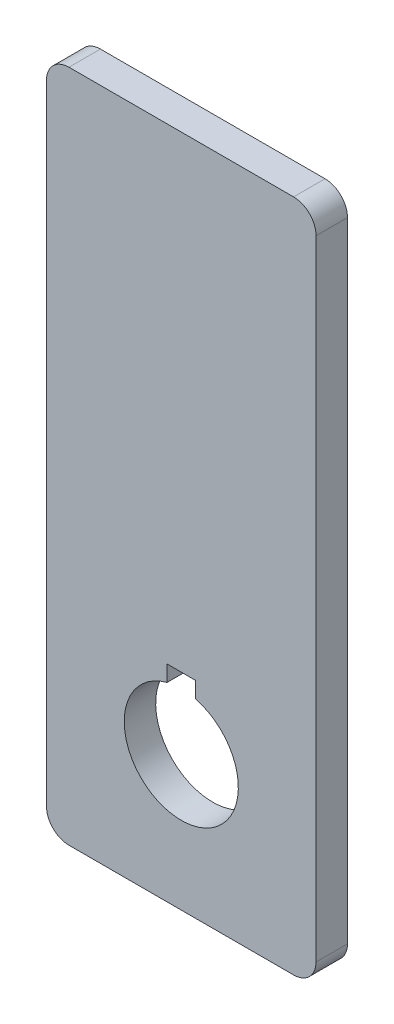
ISO-10303-21;
HEADER;
FILE_DESCRIPTION(('STEP AP214'),'2;1');
FILE_NAME('part.step','',(''),(''),'','','');
FILE_SCHEMA(('AUTOMOTIVE_DESIGN { 1 0 10303 214 1 1 1 1 }'));
ENDSEC;
DATA;
#1=APPLICATION_CONTEXT('core data for automotive mechanical design processes');
#2=APPLICATION_PROTOCOL_DEFINITION('international standard','automotive_design',2000,#1);
#3=PRODUCT_CONTEXT('',#1,'mechanical');
#4=PRODUCT('Part','Part','',(#3));
#5=PRODUCT_RELATED_PRODUCT_CATEGORY('part','',(#4));
#6=PRODUCT_DEFINITION_FORMATION('','',#4);
#7=PRODUCT_DEFINITION_CONTEXT('part definition',#1,'design');
#8=PRODUCT_DEFINITION('design','',#6,#7);
#9=PRODUCT_DEFINITION_SHAPE('','',#8);
#10=(LENGTH_UNIT() NAMED_UNIT(*) SI_UNIT(.MILLI.,.METRE.));
#11=(NAMED_UNIT(*) PLANE_ANGLE_UNIT() SI_UNIT($,.RADIAN.));
#12=(NAMED_UNIT(*) SI_UNIT($,.STERADIAN.) SOLID_ANGLE_UNIT());
#13=UNCERTAINTY_MEASURE_WITH_UNIT(LENGTH_MEASURE(1.E-05),#10,'distance_accuracy_value','');
#14=(GEOMETRIC_REPRESENTATION_CONTEXT(3) GLOBAL_UNCERTAINTY_ASSIGNED_CONTEXT((#13)) GLOBAL_UNIT_ASSIGNED_CONTEXT((#10,
#11,#12)) REPRESENTATION_CONTEXT('',''));
#15=CARTESIAN_POINT('',(0.,0.,0.));
#16=DIRECTION('',(0.,0.,1.));
#17=DIRECTION('',(1.,0.,0.));
#18=AXIS2_PLACEMENT_3D('',#15,#16,#17);
#19=CARTESIAN_POINT('',(25.,-25.,7.));
#20=DIRECTION('',(0.,0.,1.));
#21=DIRECTION('',(1.,0.,0.));
#22=AXIS2_PLACEMENT_3D('',#19,#20,#21);
#23=PLANE('',#22);
#24=DIRECTION('',(0.,-1.,0.));
#25=VECTOR('',#24,1.);
#26=CARTESIAN_POINT('',(-3.175,15.875,7.));
#27=LINE('',#26,#25);
#28=CARTESIAN_POINT('',(-3.175,15.875,7.));
#29=VERTEX_POINT('',#28);
#30=CARTESIAN_POINT('',(-3.175,12.2967221242086,7.));
#31=VERTEX_POINT('',#30);
#32=EDGE_CURVE('E186',#29,#31,#27,.T.);
#33=ORIENTED_EDGE('',*,*,#32,.F.);
#34=DIRECTION('',(-1.,0.,0.));
#35=VECTOR('',#34,1.);
#36=CARTESIAN_POINT('',(3.175,15.875,7.));
#37=LINE('',#36,#35);
#38=CARTESIAN_POINT('',(3.175,15.875,7.));
#39=VERTEX_POINT('',#38);
#40=EDGE_CURVE('E310',#39,#29,#37,.T.);
#41=ORIENTED_EDGE('',*,*,#40,.F.);
#42=DIRECTION('',(0.,1.,0.));
#43=VECTOR('',#42,1.);
#44=CARTESIAN_POINT('',(3.175,15.875,7.));
#45=LINE('',#44,#43);
#46=CARTESIAN_POINT('',(3.175,12.2967221242085,7.));
#47=VERTEX_POINT('',#46);
#48=EDGE_CURVE('E305',#47,#39,#45,.T.);
#49=ORIENTED_EDGE('',*,*,#48,.F.);
#50=CARTESIAN_POINT('',(0.,0.,7.));
#51=DIRECTION('',(0.,0.,1.));
#52=DIRECTION('',(1.,0.,0.));
#53=AXIS2_PLACEMENT_3D('',#50,#51,#52);
#54=CIRCLE('',#53,12.7);
#55=EDGE_CURVE('E145',#31,#47,#54,.T.);
#56=ORIENTED_EDGE('',*,*,#55,.F.);
#57=EDGE_LOOP('',(#33,#41,#49,#56));
#58=FACE_BOUND('',#57,.T.);
#59=CARTESIAN_POINT('',(25.,-25.,7.));
#60=DIRECTION('',(0.,0.,1.));
#61=DIRECTION('',(1.,0.,0.));
#62=AXIS2_PLACEMENT_3D('',#59,#60,#61);
#63=CIRCLE('',#62,5.);
#64=CARTESIAN_POINT('',(25.,-30.,7.));
#65=VERTEX_POINT('',#64);
#66=CARTESIAN_POINT('',(30.,-25.,7.));
#67=VERTEX_POINT('',#66);
#68=EDGE_CURVE('E157',#65,#67,#63,.T.);
#69=ORIENTED_EDGE('',*,*,#68,.T.);
#70=DIRECTION('',(0.,1.,0.));
#71=VECTOR('',#70,1.);
#72=CARTESIAN_POINT('',(30.,-25.,7.));
#73=LINE('',#72,#71);
#74=CARTESIAN_POINT('',(30.,115.,7.));
#75=VERTEX_POINT('',#74);
#76=EDGE_CURVE('E99',#67,#75,#73,.T.);
#77=ORIENTED_EDGE('',*,*,#76,.T.);
#78=CARTESIAN_POINT('',(25.,115.,7.));
#79=DIRECTION('',(0.,0.,1.));
#80=DIRECTION('',(-1.,0.,0.));
#81=AXIS2_PLACEMENT_3D('',#78,#79,#80);
#82=CIRCLE('',#81,5.);
#83=CARTESIAN_POINT('',(25.,120.,7.));
#84=VERTEX_POINT('',#83);
#85=EDGE_CURVE('E203',#75,#84,#82,.T.);
#86=ORIENTED_EDGE('',*,*,#85,.T.);
#87=DIRECTION('',(-1.,0.,0.));
#88=VECTOR('',#87,1.);
#89=CARTESIAN_POINT('',(-25.,120.,7.));
#90=LINE('',#89,#88);
#91=CARTESIAN_POINT('',(-25.,120.,7.));
#92=VERTEX_POINT('',#91);
#93=EDGE_CURVE('E205',#84,#92,#90,.T.);
#94=ORIENTED_EDGE('',*,*,#93,.T.);
#95=CARTESIAN_POINT('',(-25.,115.,7.));
#96=DIRECTION('',(0.,0.,1.));
#97=DIRECTION('',(-1.,0.,0.));
#98=AXIS2_PLACEMENT_3D('',#95,#96,#97);
#99=CIRCLE('',#98,5.);
#100=CARTESIAN_POINT('',(-30.,115.,7.));
#101=VERTEX_POINT('',#100);
#102=EDGE_CURVE('E120',#92,#101,#99,.T.);
#103=ORIENTED_EDGE('',*,*,#102,.T.);
#104=DIRECTION('',(0.,-1.,0.));
#105=VECTOR('',#104,1.);
#106=CARTESIAN_POINT('',(-30.,-25.,7.));
#107=LINE('',#106,#105);
#108=CARTESIAN_POINT('',(-30.,-25.,7.));
#109=VERTEX_POINT('',#108);
#110=EDGE_CURVE('E114',#101,#109,#107,.T.);
#111=ORIENTED_EDGE('',*,*,#110,.T.);
#112=CARTESIAN_POINT('',(-25.,-25.,7.));
#113=DIRECTION('',(0.,0.,1.));
#114=DIRECTION('',(-1.,0.,0.));
#115=AXIS2_PLACEMENT_3D('',#112,#113,#114);
#116=CIRCLE('',#115,5.);
#117=CARTESIAN_POINT('',(-25.,-30.,7.));
#118=VERTEX_POINT('',#117);
#119=EDGE_CURVE('E117',#109,#118,#116,.T.);
#120=ORIENTED_EDGE('',*,*,#119,.T.);
#121=DIRECTION('',(1.,0.,0.));
#122=VECTOR('',#121,1.);
#123=CARTESIAN_POINT('',(-25.,-30.,7.));
#124=LINE('',#123,#122);
#125=EDGE_CURVE('E57',#118,#65,#124,.T.);
#126=ORIENTED_EDGE('',*,*,#125,.T.);
#127=EDGE_LOOP('',(#69,#77,#86,#94,#103,#111,#120,#126));
#128=FACE_BOUND('',#127,.T.);
#129=ADVANCED_FACE('F33',(#58,#128),#23,.T.);
#130=CARTESIAN_POINT('',(25.,-25.,0.));
#131=DIRECTION('',(0.,0.,1.));
#132=DIRECTION('',(1.,0.,0.));
#133=AXIS2_PLACEMENT_3D('',#130,#131,#132);
#134=PLANE('',#133);
#135=CARTESIAN_POINT('',(25.,-25.,0.));
#136=DIRECTION('',(0.,0.,1.));
#137=DIRECTION('',(1.,0.,0.));
#138=AXIS2_PLACEMENT_3D('',#135,#136,#137);
#139=CIRCLE('',#138,5.);
#140=CARTESIAN_POINT('',(25.,-30.,0.));
#141=VERTEX_POINT('',#140);
#142=CARTESIAN_POINT('',(30.,-25.,0.));
#143=VERTEX_POINT('',#142);
#144=EDGE_CURVE('E141',#141,#143,#139,.T.);
#145=ORIENTED_EDGE('',*,*,#144,.F.);
#146=DIRECTION('',(1.,0.,0.));
#147=VECTOR('',#146,1.);
#148=CARTESIAN_POINT('',(-25.,-30.,0.));
#149=LINE('',#148,#147);
#150=CARTESIAN_POINT('',(-25.,-30.,0.));
#151=VERTEX_POINT('',#150);
#152=EDGE_CURVE('E90',#151,#141,#149,.T.);
#153=ORIENTED_EDGE('',*,*,#152,.F.);
#154=CARTESIAN_POINT('',(-25.,-25.,0.));
#155=DIRECTION('',(0.,0.,1.));
#156=DIRECTION('',(-1.,0.,0.));
#157=AXIS2_PLACEMENT_3D('',#154,#155,#156);
#158=CIRCLE('',#157,5.);
#159=CARTESIAN_POINT('',(-30.,-25.,0.));
#160=VERTEX_POINT('',#159);
#161=EDGE_CURVE('E154',#160,#151,#158,.T.);
#162=ORIENTED_EDGE('',*,*,#161,.F.);
#163=DIRECTION('',(0.,-1.,0.));
#164=VECTOR('',#163,1.);
#165=CARTESIAN_POINT('',(-30.,-25.,0.));
#166=LINE('',#165,#164);
#167=CARTESIAN_POINT('',(-30.,115.,0.));
#168=VERTEX_POINT('',#167);
#169=EDGE_CURVE('E129',#168,#160,#166,.T.);
#170=ORIENTED_EDGE('',*,*,#169,.F.);
#171=CARTESIAN_POINT('',(-25.,115.,0.));
#172=DIRECTION('',(0.,0.,1.));
#173=DIRECTION('',(-1.,0.,0.));
#174=AXIS2_PLACEMENT_3D('',#171,#172,#173);
#175=CIRCLE('',#174,5.);
#176=CARTESIAN_POINT('',(-25.,120.,0.));
#177=VERTEX_POINT('',#176);
#178=EDGE_CURVE('E151',#177,#168,#175,.T.);
#179=ORIENTED_EDGE('',*,*,#178,.F.);
#180=DIRECTION('',(-1.,0.,0.));
#181=VECTOR('',#180,1.);
#182=CARTESIAN_POINT('',(-25.,120.,0.));
#183=LINE('',#182,#181);
#184=CARTESIAN_POINT('',(25.,120.,0.));
#185=VERTEX_POINT('',#184);
#186=EDGE_CURVE('E149',#185,#177,#183,.T.);
#187=ORIENTED_EDGE('',*,*,#186,.F.);
#188=CARTESIAN_POINT('',(25.,115.,0.));
#189=DIRECTION('',(0.,0.,1.));
#190=DIRECTION('',(-1.,0.,0.));
#191=AXIS2_PLACEMENT_3D('',#188,#189,#190);
#192=CIRCLE('',#191,5.);
#193=CARTESIAN_POINT('',(30.,115.,0.));
#194=VERTEX_POINT('',#193);
#195=EDGE_CURVE('E147',#194,#185,#192,.T.);
#196=ORIENTED_EDGE('',*,*,#195,.F.);
#197=DIRECTION('',(0.,1.,0.));
#198=VECTOR('',#197,1.);
#199=CARTESIAN_POINT('',(30.,-25.,0.));
#200=LINE('',#199,#198);
#201=EDGE_CURVE('E144',#143,#194,#200,.T.);
#202=ORIENTED_EDGE('',*,*,#201,.F.);
#203=EDGE_LOOP('',(#145,#153,#162,#170,#179,#187,#196,#202));
#204=FACE_BOUND('',#203,.T.);
#205=DIRECTION('',(-1.,0.,0.));
#206=VECTOR('',#205,1.);
#207=CARTESIAN_POINT('',(25.,15.875,0.));
#208=LINE('',#207,#206);
#209=CARTESIAN_POINT('',(3.175,15.875,0.));
#210=VERTEX_POINT('',#209);
#211=CARTESIAN_POINT('',(-3.175,15.875,0.));
#212=VERTEX_POINT('',#211);
#213=EDGE_CURVE('E11',#210,#212,#208,.T.);
#214=ORIENTED_EDGE('',*,*,#213,.T.);
#215=DIRECTION('',(0.,-1.,0.));
#216=VECTOR('',#215,1.);
#217=CARTESIAN_POINT('',(-3.175,-25.,0.));
#218=LINE('',#217,#216);
#219=CARTESIAN_POINT('',(-3.175,12.2967221242086,0.));
#220=VERTEX_POINT('',#219);
#221=EDGE_CURVE('E182',#212,#220,#218,.T.);
#222=ORIENTED_EDGE('',*,*,#221,.T.);
#223=CARTESIAN_POINT('',(0.,0.,0.));
#224=DIRECTION('',(0.,0.,1.));
#225=DIRECTION('',(1.,0.,0.));
#226=AXIS2_PLACEMENT_3D('',#223,#224,#225);
#227=CIRCLE('',#226,12.7);
#228=CARTESIAN_POINT('',(3.175,12.2967221242085,0.));
#229=VERTEX_POINT('',#228);
#230=EDGE_CURVE('E194',#220,#229,#227,.T.);
#231=ORIENTED_EDGE('',*,*,#230,.T.);
#232=DIRECTION('',(0.,1.,0.));
#233=VECTOR('',#232,1.);
#234=CARTESIAN_POINT('',(3.175,-25.,0.));
#235=LINE('',#234,#233);
#236=EDGE_CURVE('E48',#229,#210,#235,.T.);
#237=ORIENTED_EDGE('',*,*,#236,.T.);
#238=EDGE_LOOP('',(#214,#222,#231,#237));
#239=FACE_BOUND('',#238,.T.);
#240=ADVANCED_FACE('F193',(#204,#239),#134,.F.);
#241=CARTESIAN_POINT('',(25.,-25.,7.));
#242=DIRECTION('',(0.,0.,-1.));
#243=DIRECTION('',(-1.,0.,0.));
#244=AXIS2_PLACEMENT_3D('',#241,#242,#243);
#245=CYLINDRICAL_SURFACE('',#244,5.);
#246=ORIENTED_EDGE('',*,*,#144,.T.);
#247=DIRECTION('',(0.,0.,-1.));
#248=VECTOR('',#247,1.);
#249=CARTESIAN_POINT('',(30.,-25.,7.));
#250=LINE('',#249,#248);
#251=EDGE_CURVE('E170',#67,#143,#250,.T.);
#252=ORIENTED_EDGE('',*,*,#251,.F.);
#253=ORIENTED_EDGE('',*,*,#68,.F.);
#254=DIRECTION('',(0.,0.,-1.));
#255=VECTOR('',#254,1.);
#256=CARTESIAN_POINT('',(25.,-30.,7.));
#257=LINE('',#256,#255);
#258=EDGE_CURVE('E137',#65,#141,#257,.T.);
#259=ORIENTED_EDGE('',*,*,#258,.T.);
#260=EDGE_LOOP('',(#246,#252,#253,#259));
#261=FACE_BOUND('',#260,.T.);
#262=ADVANCED_FACE('F35',(#261),#245,.T.);
#263=CARTESIAN_POINT('',(30.,-25.,7.));
#264=DIRECTION('',(-1.,0.,0.));
#265=DIRECTION('',(0.,0.,1.));
#266=AXIS2_PLACEMENT_3D('',#263,#264,#265);
#267=PLANE('',#266);
#268=ORIENTED_EDGE('',*,*,#201,.T.);
#269=DIRECTION('',(0.,0.,-1.));
#270=VECTOR('',#269,1.);
#271=CARTESIAN_POINT('',(30.,115.,7.));
#272=LINE('',#271,#270);
#273=EDGE_CURVE('E167',#75,#194,#272,.T.);
#274=ORIENTED_EDGE('',*,*,#273,.F.);
#275=ORIENTED_EDGE('',*,*,#76,.F.);
#276=ORIENTED_EDGE('',*,*,#251,.T.);
#277=EDGE_LOOP('',(#268,#274,#275,#276));
#278=FACE_BOUND('',#277,.T.);
#279=ADVANCED_FACE('F222',(#278),#267,.F.);
#280=CARTESIAN_POINT('',(25.,115.,7.));
#281=DIRECTION('',(0.,0.,-1.));
#282=DIRECTION('',(-1.,0.,0.));
#283=AXIS2_PLACEMENT_3D('',#280,#281,#282);
#284=CYLINDRICAL_SURFACE('',#283,5.);
#285=ORIENTED_EDGE('',*,*,#195,.T.);
#286=DIRECTION('',(0.,0.,-1.));
#287=VECTOR('',#286,1.);
#288=CARTESIAN_POINT('',(25.,120.,7.));
#289=LINE('',#288,#287);
#290=EDGE_CURVE('E164',#84,#185,#289,.T.);
#291=ORIENTED_EDGE('',*,*,#290,.F.);
#292=ORIENTED_EDGE('',*,*,#85,.F.);
#293=ORIENTED_EDGE('',*,*,#273,.T.);
#294=EDGE_LOOP('',(#285,#291,#292,#293));
#295=FACE_BOUND('',#294,.T.);
#296=ADVANCED_FACE('F225',(#295),#284,.T.);
#297=CARTESIAN_POINT('',(-25.,120.,7.));
#298=DIRECTION('',(0.,-1.,0.));
#299=DIRECTION('',(0.,0.,-1.));
#300=AXIS2_PLACEMENT_3D('',#297,#298,#299);
#301=PLANE('',#300);
#302=ORIENTED_EDGE('',*,*,#186,.T.);
#303=DIRECTION('',(0.,0.,-1.));
#304=VECTOR('',#303,1.);
#305=CARTESIAN_POINT('',(-25.,120.,7.));
#306=LINE('',#305,#304);
#307=EDGE_CURVE('E161',#92,#177,#306,.T.);
#308=ORIENTED_EDGE('',*,*,#307,.F.);
#309=ORIENTED_EDGE('',*,*,#93,.F.);
#310=ORIENTED_EDGE('',*,*,#290,.T.);
#311=EDGE_LOOP('',(#302,#308,#309,#310));
#312=FACE_BOUND('',#311,.T.);
#313=ADVANCED_FACE('F211',(#312),#301,.F.);
#314=CARTESIAN_POINT('',(-25.,115.,7.));
#315=DIRECTION('',(0.,0.,-1.));
#316=DIRECTION('',(-1.,0.,0.));
#317=AXIS2_PLACEMENT_3D('',#314,#315,#316);
#318=CYLINDRICAL_SURFACE('',#317,5.);
#319=ORIENTED_EDGE('',*,*,#178,.T.);
#320=DIRECTION('',(0.,0.,-1.));
#321=VECTOR('',#320,1.);
#322=CARTESIAN_POINT('',(-30.,115.,7.));
#323=LINE('',#322,#321);
#324=EDGE_CURVE('E132',#101,#168,#323,.T.);
#325=ORIENTED_EDGE('',*,*,#324,.F.);
#326=ORIENTED_EDGE('',*,*,#102,.F.);
#327=ORIENTED_EDGE('',*,*,#307,.T.);
#328=EDGE_LOOP('',(#319,#325,#326,#327));
#329=FACE_BOUND('',#328,.T.);
#330=ADVANCED_FACE('F215',(#329),#318,.T.);
#331=CARTESIAN_POINT('',(-30.,-25.,7.));
#332=DIRECTION('',(1.,0.,0.));
#333=DIRECTION('',(0.,0.,-1.));
#334=AXIS2_PLACEMENT_3D('',#331,#332,#333);
#335=PLANE('',#334);
#336=ORIENTED_EDGE('',*,*,#169,.T.);
#337=DIRECTION('',(0.,0.,-1.));
#338=VECTOR('',#337,1.);
#339=CARTESIAN_POINT('',(-30.,-25.,7.));
#340=LINE('',#339,#338);
#341=EDGE_CURVE('E126',#109,#160,#340,.T.);
#342=ORIENTED_EDGE('',*,*,#341,.F.);
#343=ORIENTED_EDGE('',*,*,#110,.F.);
#344=ORIENTED_EDGE('',*,*,#324,.T.);
#345=EDGE_LOOP('',(#336,#342,#343,#344));
#346=FACE_BOUND('',#345,.T.);
#347=ADVANCED_FACE('F127',(#346),#335,.F.);
#348=CARTESIAN_POINT('',(-25.,-25.,7.));
#349=DIRECTION('',(0.,0.,-1.));
#350=DIRECTION('',(-1.,0.,0.));
#351=AXIS2_PLACEMENT_3D('',#348,#349,#350);
#352=CYLINDRICAL_SURFACE('',#351,5.);
#353=ORIENTED_EDGE('',*,*,#161,.T.);
#354=DIRECTION('',(0.,0.,-1.));
#355=VECTOR('',#354,1.);
#356=CARTESIAN_POINT('',(-25.,-30.,7.));
#357=LINE('',#356,#355);
#358=EDGE_CURVE('E133',#118,#151,#357,.T.);
#359=ORIENTED_EDGE('',*,*,#358,.F.);
#360=ORIENTED_EDGE('',*,*,#119,.F.);
#361=ORIENTED_EDGE('',*,*,#341,.T.);
#362=EDGE_LOOP('',(#353,#359,#360,#361));
#363=FACE_BOUND('',#362,.T.);
#364=ADVANCED_FACE('F135',(#363),#352,.T.);
#365=CARTESIAN_POINT('',(-25.,-30.,7.));
#366=DIRECTION('',(0.,1.,0.));
#367=DIRECTION('',(0.,0.,1.));
#368=AXIS2_PLACEMENT_3D('',#365,#366,#367);
#369=PLANE('',#368);
#370=ORIENTED_EDGE('',*,*,#152,.T.);
#371=ORIENTED_EDGE('',*,*,#258,.F.);
#372=ORIENTED_EDGE('',*,*,#125,.F.);
#373=ORIENTED_EDGE('',*,*,#358,.T.);
#374=EDGE_LOOP('',(#370,#371,#372,#373));
#375=FACE_BOUND('',#374,.T.);
#376=ADVANCED_FACE('F218',(#375),#369,.F.);
#377=CARTESIAN_POINT('',(0.,0.,7.));
#378=DIRECTION('',(0.,0.,-1.));
#379=DIRECTION('',(-1.,0.,0.));
#380=AXIS2_PLACEMENT_3D('',#377,#378,#379);
#381=CYLINDRICAL_SURFACE('',#380,12.7);
#382=DIRECTION('',(0.,0.,-1.));
#383=VECTOR('',#382,1.);
#384=CARTESIAN_POINT('',(-3.175,12.2967221242086,7.));
#385=LINE('',#384,#383);
#386=EDGE_CURVE('E41',#31,#220,#385,.T.);
#387=ORIENTED_EDGE('',*,*,#386,.F.);
#388=ORIENTED_EDGE('',*,*,#55,.T.);
#389=DIRECTION('',(0.,0.,-1.));
#390=VECTOR('',#389,1.);
#391=CARTESIAN_POINT('',(3.175,12.2967221242085,7.));
#392=LINE('',#391,#390);
#393=EDGE_CURVE('E172',#229,#47,#392,.F.);
#394=ORIENTED_EDGE('',*,*,#393,.F.);
#395=ORIENTED_EDGE('',*,*,#230,.F.);
#396=EDGE_LOOP('',(#387,#388,#394,#395));
#397=FACE_BOUND('',#396,.T.);
#398=ADVANCED_FACE('F197',(#397),#381,.F.);
#399=CARTESIAN_POINT('',(3.175,15.875,-3.));
#400=DIRECTION('',(0.,1.,0.));
#401=DIRECTION('',(0.,0.,1.));
#402=AXIS2_PLACEMENT_3D('',#399,#400,#401);
#403=PLANE('',#402);
#404=DIRECTION('',(0.,0.,1.));
#405=VECTOR('',#404,1.);
#406=CARTESIAN_POINT('',(3.175,15.875,-3.));
#407=LINE('',#406,#405);
#408=EDGE_CURVE('E312',#210,#39,#407,.T.);
#409=ORIENTED_EDGE('',*,*,#408,.T.);
#410=ORIENTED_EDGE('',*,*,#40,.T.);
#411=DIRECTION('',(0.,0.,1.));
#412=VECTOR('',#411,1.);
#413=CARTESIAN_POINT('',(-3.175,15.875,-3.));
#414=LINE('',#413,#412);
#415=EDGE_CURVE('E316',#212,#29,#414,.T.);
#416=ORIENTED_EDGE('',*,*,#415,.F.);
#417=ORIENTED_EDGE('',*,*,#213,.F.);
#418=EDGE_LOOP('',(#409,#410,#416,#417));
#419=FACE_BOUND('',#418,.T.);
#420=ADVANCED_FACE('F273',(#419),#403,.F.);
#421=CARTESIAN_POINT('',(-3.175,15.875,-3.));
#422=DIRECTION('',(-1.,0.,0.));
#423=DIRECTION('',(0.,-1.,0.));
#424=AXIS2_PLACEMENT_3D('',#421,#422,#423);
#425=PLANE('',#424);
#426=ORIENTED_EDGE('',*,*,#415,.T.);
#427=ORIENTED_EDGE('',*,*,#32,.T.);
#428=ORIENTED_EDGE('',*,*,#386,.T.);
#429=ORIENTED_EDGE('',*,*,#221,.F.);
#430=EDGE_LOOP('',(#426,#427,#428,#429));
#431=FACE_BOUND('',#430,.T.);
#432=ADVANCED_FACE('F180',(#431),#425,.F.);
#433=CARTESIAN_POINT('',(3.175,15.875,-3.));
#434=DIRECTION('',(1.,0.,0.));
#435=DIRECTION('',(0.,1.,0.));
#436=AXIS2_PLACEMENT_3D('',#433,#434,#435);
#437=PLANE('',#436);
#438=ORIENTED_EDGE('',*,*,#393,.T.);
#439=ORIENTED_EDGE('',*,*,#48,.T.);
#440=ORIENTED_EDGE('',*,*,#408,.F.);
#441=ORIENTED_EDGE('',*,*,#236,.F.);
#442=EDGE_LOOP('',(#438,#439,#440,#441));
#443=FACE_BOUND('',#442,.T.);
#444=ADVANCED_FACE('F287',(#443),#437,.F.);
#445=CLOSED_SHELL('',(#129,#240,#262,#279,#296,#313,#330,#347,#364,#376,#398,#420,#432,#444));
#446=MANIFOLD_SOLID_BREP('B2',#445);
#447=ADVANCED_BREP_SHAPE_REPRESENTATION('',(#18,#446),#14);
#448=SHAPE_DEFINITION_REPRESENTATION(#9,#447);
ENDSEC;
END-ISO-10303-21;
